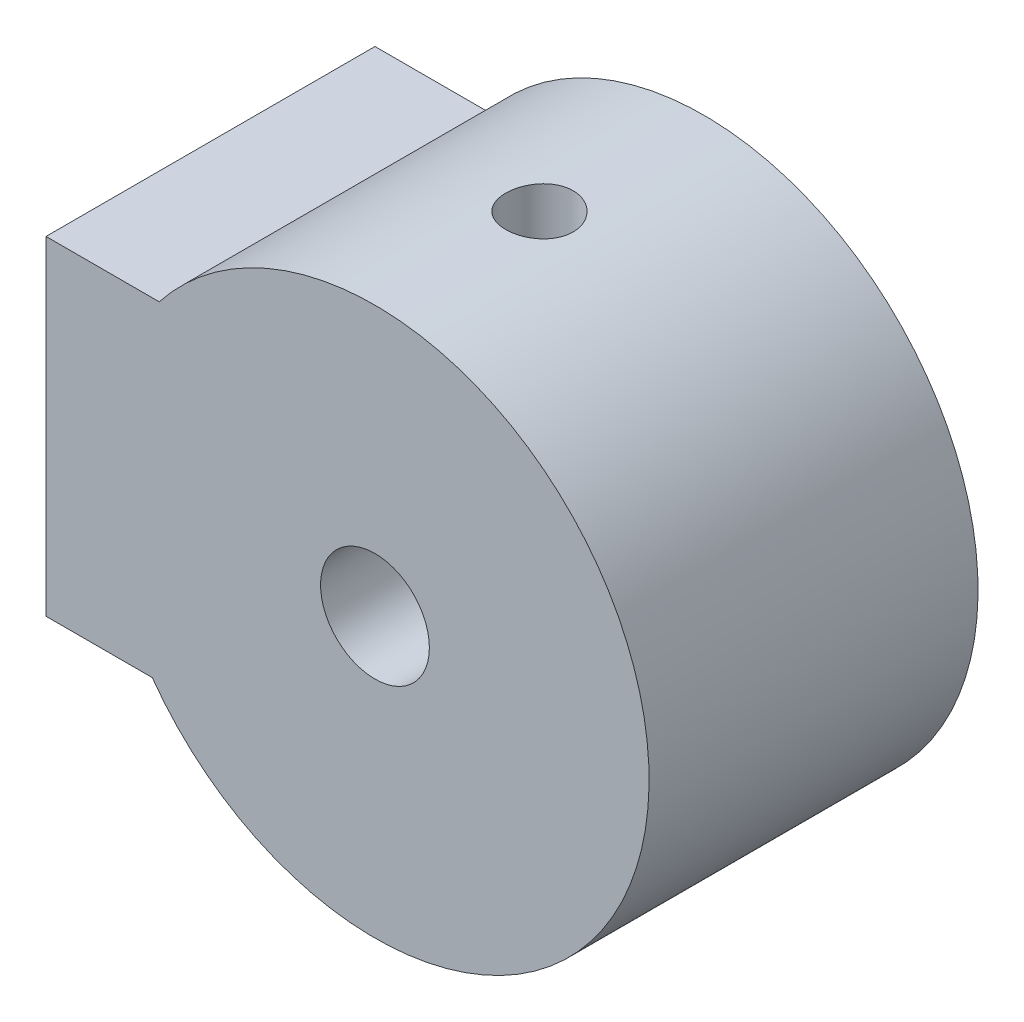
ISO-10303-21;
HEADER;
FILE_DESCRIPTION(('STEP AP214'),'2;1');
FILE_NAME('part.step','',(''),(''),'','','');
FILE_SCHEMA(('AUTOMOTIVE_DESIGN { 1 0 10303 214 1 1 1 1 }'));
ENDSEC;
DATA;
#1=APPLICATION_CONTEXT('core data for automotive mechanical design processes');
#2=APPLICATION_PROTOCOL_DEFINITION('international standard','automotive_design',2000,#1);
#3=PRODUCT_CONTEXT('',#1,'mechanical');
#4=PRODUCT('Part','Part','',(#3));
#5=PRODUCT_RELATED_PRODUCT_CATEGORY('part','',(#4));
#6=PRODUCT_DEFINITION_FORMATION('','',#4);
#7=PRODUCT_DEFINITION_CONTEXT('part definition',#1,'design');
#8=PRODUCT_DEFINITION('design','',#6,#7);
#9=PRODUCT_DEFINITION_SHAPE('','',#8);
#10=(LENGTH_UNIT() NAMED_UNIT(*) SI_UNIT(.MILLI.,.METRE.));
#11=(NAMED_UNIT(*) PLANE_ANGLE_UNIT() SI_UNIT($,.RADIAN.));
#12=(NAMED_UNIT(*) SI_UNIT($,.STERADIAN.) SOLID_ANGLE_UNIT());
#13=UNCERTAINTY_MEASURE_WITH_UNIT(LENGTH_MEASURE(1.E-05),#10,'distance_accuracy_value','');
#14=(GEOMETRIC_REPRESENTATION_CONTEXT(3) GLOBAL_UNCERTAINTY_ASSIGNED_CONTEXT((#13)) GLOBAL_UNIT_ASSIGNED_CONTEXT((#10,
#11,#12)) REPRESENTATION_CONTEXT('',''));
#15=CARTESIAN_POINT('',(0.,0.,0.));
#16=DIRECTION('',(0.,0.,1.));
#17=DIRECTION('',(1.,0.,0.));
#18=AXIS2_PLACEMENT_3D('',#15,#16,#17);
#19=CARTESIAN_POINT('',(19.05,9.25604473628377,19.05));
#20=DIRECTION('',(0.,0.,-1.));
#21=DIRECTION('',(-1.,0.,0.));
#22=AXIS2_PLACEMENT_3D('',#19,#20,#21);
#23=CYLINDRICAL_SURFACE('',#22,15.875);
#24=CARTESIAN_POINT('',(19.05,25.1310447362838,11.475));
#25=CARTESIAN_POINT('',(18.9409083643428,25.1310432359533,11.4749953560447));
#26=CARTESIAN_POINT('',(18.8317481815271,25.1299083507984,11.465814534338));
#27=CARTESIAN_POINT('',(18.616464302043,25.1254902293752,11.4293347568982));
#28=CARTESIAN_POINT('',(18.5103439147029,25.1222047381502,11.4020167835412));
#29=CARTESIAN_POINT('',(18.3042875505686,25.1138556039573,11.3300787802362));
#30=CARTESIAN_POINT('',(18.2043475029054,25.1087931464367,11.2854702830557));
#31=CARTESIAN_POINT('',(18.0133915108261,25.0974534150214,11.1802424652643));
#32=CARTESIAN_POINT('',(17.9223740162678,25.0911763527092,11.1196259325617));
#33=CARTESIAN_POINT('',(17.7513429490255,25.0780710927105,10.9837575835535));
#34=CARTESIAN_POINT('',(17.6713837146966,25.0712404180887,10.9084375981876));
#35=CARTESIAN_POINT('',(17.5252068104353,25.0578178123172,10.7454466967293));
#36=CARTESIAN_POINT('',(17.4589898344333,25.0512258932375,10.6577751573066));
#37=CARTESIAN_POINT('',(17.3419755614588,25.0390027075675,10.4722178237964));
#38=CARTESIAN_POINT('',(17.2912290228033,25.0333746292392,10.3742997929141));
#39=CARTESIAN_POINT('',(17.2069202812983,25.0237488673918,10.1712507961796));
#40=CARTESIAN_POINT('',(17.1733574486991,25.0197511241252,10.066120094818));
#41=CARTESIAN_POINT('',(17.1245336186474,25.0138622268302,9.85219319749525));
#42=CARTESIAN_POINT('',(17.109181003301,25.0119605307777,9.74341820642189));
#43=CARTESIAN_POINT('',(17.0969299426077,25.0104467450156,9.52482027436539));
#44=CARTESIAN_POINT('',(17.1000307797705,25.010834566287,9.41499737429185));
#45=CARTESIAN_POINT('',(17.1245233669943,25.0138463499001,9.19805893125664));
#46=CARTESIAN_POINT('',(17.1458142809262,25.0164579843358,9.09093180833696));
#47=CARTESIAN_POINT('',(17.2059253628627,25.0236038987797,8.88178257397178));
#48=CARTESIAN_POINT('',(17.2447458748643,25.0281382165182,8.7797605627515));
#49=CARTESIAN_POINT('',(17.3389228418646,25.0386325927656,8.58340382196518));
#50=CARTESIAN_POINT('',(17.3943232031673,25.0445964284316,8.4890903609214));
#51=CARTESIAN_POINT('',(17.5200558335176,25.0572749219276,8.31106096012575));
#52=CARTESIAN_POINT('',(17.590388762192,25.0639896129193,8.22734548878723));
#53=CARTESIAN_POINT('',(17.7445492857712,25.0774680556345,8.07230309340675));
#54=CARTESIAN_POINT('',(17.8284638122925,25.0842318356984,8.00106258048572));
#55=CARTESIAN_POINT('',(18.0071059480917,25.0970043840567,7.8736648816185));
#56=CARTESIAN_POINT('',(18.1018335808671,25.1030131507104,7.81750772845019));
#57=CARTESIAN_POINT('',(18.299478954148,25.1136021957743,7.72187111610527));
#58=CARTESIAN_POINT('',(18.402399291316,25.1181820190028,7.68239696978903));
#59=CARTESIAN_POINT('',(18.6134762028136,25.1253929854182,7.62131499324888));
#60=CARTESIAN_POINT('',(18.721632540237,25.1280242166828,7.59970635548679));
#61=CARTESIAN_POINT('',(18.9393640276831,25.1310300951961,7.57508055556936));
#62=CARTESIAN_POINT('',(19.0489255207831,25.1314191926904,7.57194433827909));
#63=CARTESIAN_POINT('',(19.2670125377665,25.1299359525648,7.58403835887203));
#64=CARTESIAN_POINT('',(19.3755380828914,25.128063661414,7.59926821935188));
#65=CARTESIAN_POINT('',(19.5881219986482,25.1222770441713,7.64756318359314));
#66=CARTESIAN_POINT('',(19.692193435241,25.1183692077425,7.68057161756198));
#67=CARTESIAN_POINT('',(19.893323454738,25.1089490921984,7.76342788747769));
#68=CARTESIAN_POINT('',(19.9903818068662,25.1034367603148,7.81327627726212));
#69=CARTESIAN_POINT('',(20.1752628609096,25.0913863764848,7.92868617745236));
#70=CARTESIAN_POINT('',(20.2630370868871,25.0848433459949,7.99432481525716));
#71=CARTESIAN_POINT('',(20.4263653423935,25.0714793305272,8.13934271753309));
#72=CARTESIAN_POINT('',(20.5019189038951,25.0646583349164,8.21872250802216));
#73=CARTESIAN_POINT('',(20.6390826917969,25.0514626777424,8.38949338081263));
#74=CARTESIAN_POINT('',(20.700614072545,25.0450906728285,8.48094802733327));
#75=CARTESIAN_POINT('',(20.8074424065883,25.0335578622644,8.67296362159593));
#76=CARTESIAN_POINT('',(20.8527396758609,25.0283970330409,8.77352439205049));
#77=CARTESIAN_POINT('',(20.9256859007477,25.0198888689889,8.98064176127574));
#78=CARTESIAN_POINT('',(20.9533795434053,25.0165369455254,9.08718242486343));
#79=CARTESIAN_POINT('',(20.9904764095143,25.0120128523629,9.30344559111588));
#80=CARTESIAN_POINT('',(20.999880452299,25.0108405850201,9.41316795102422));
#81=CARTESIAN_POINT('',(21.0001164913923,25.0108113067968,9.63189556518495));
#82=CARTESIAN_POINT('',(20.9910723544037,25.0119388542553,9.74090070447582));
#83=CARTESIAN_POINT('',(20.9549308187889,25.0163489869564,9.95582921735795));
#84=CARTESIAN_POINT('',(20.9278334162005,25.019631572672,10.0617525902728));
#85=CARTESIAN_POINT('',(20.8563928550996,25.0279771882843,10.2674959323579));
#86=CARTESIAN_POINT('',(20.8120554467467,25.0330396244833,10.3673179237248));
#87=CARTESIAN_POINT('',(20.7074056638004,25.0443755351535,10.5581248809151));
#88=CARTESIAN_POINT('',(20.6470931162568,25.0506490227356,10.6491097510513));
#89=CARTESIAN_POINT('',(20.5117449195196,25.0637506485335,10.8202931432372));
#90=CARTESIAN_POINT('',(20.4366169334528,25.0705820992451,10.9004184093192));
#91=CARTESIAN_POINT('',(20.2739624902651,25.0840005599526,11.0469726710189));
#92=CARTESIAN_POINT('',(20.1864331100613,25.0905875118555,11.1133984284899));
#93=CARTESIAN_POINT('',(20.0010926823431,25.1028014311103,11.2308748233476));
#94=CARTESIAN_POINT('',(19.903245021388,25.1084247804647,11.2818680428433));
#95=CARTESIAN_POINT('',(19.7003616367364,25.1180410396347,11.3666270676105));
#96=CARTESIAN_POINT('',(19.5953338942139,25.1220357264922,11.4004116593957));
#97=CARTESIAN_POINT('',(19.4164648109537,25.126977709808,11.4416751975968));
#98=CARTESIAN_POINT('',(19.3437529872773,25.1284954450309,11.4541541232119));
#99=CARTESIAN_POINT('',(19.197371200054,25.1305294615522,11.4708180639596));
#100=CARTESIAN_POINT('',(19.1237012432481,25.1310457498924,11.4750031374109));
#101=CARTESIAN_POINT('',(19.05,25.1310447362838,11.475));
#102=B_SPLINE_CURVE_WITH_KNOTS('',3,(#24,#25,#26,#27,#28,#29,#30,#31,#32,#33,#34,#35,#36,#37,
#38,#39,#40,#41,#42,#43,#44,#45,#46,#47,#48,#49,#50,#51,#52,#53,#54,#55,#56,#57,#58,#59,#60,#61,
#62,#63,#64,#65,#66,#67,#68,#69,#70,#71,#72,#73,#74,#75,#76,#77,#78,#79,#80,#81,#82,#83,#84,#85,
#86,#87,#88,#89,#90,#91,#92,#93,#94,#95,#96,#97,#98,#99,#100,#101),.UNSPECIFIED.,.T.,.F.,(4,2,2,
2,2,2,2,2,2,2,2,2,2,2,2,2,2,2,2,2,2,2,2,2,2,2,2,2,2,2,2,2,2,2,2,2,2,2,4),(0.,0.327005707130553,
0.654354837194615,0.981486000299128,1.30856022881588,1.63718850480973,1.96583337121433,
2.29554519184131,2.62524492830033,2.95327877138886,3.28129986024671,3.60751428578232,
3.93373511315536,4.26082759112558,4.58793452099079,4.91722458863021,5.24651537184951,
5.57591094194033,5.90529162221994,6.2325470940088,6.55979584116038,6.88600759251479,
7.21223007346469,7.54007955036916,7.86794158028565,8.19760400663521,8.52726001615431,
8.85607581187648,9.18487687704405,9.51147753939168,9.8380782734195,10.1645701677125,
10.4910655968194,10.8196641592899,11.1483403036608,11.4782246892999,11.8077481669054,
12.0286715813092,12.2495934422709),.UNSPECIFIED.);
#103=CARTESIAN_POINT('',(19.05,25.1310447362838,11.475));
#104=VERTEX_POINT('',#103);
#105=EDGE_CURVE('E121',#104,#104,#102,.T.);
#106=ORIENTED_EDGE('',*,*,#105,.T.);
#107=EDGE_LOOP('',(#106));
#108=FACE_BOUND('',#107,.T.);
#109=CARTESIAN_POINT('',(19.05,9.25604473628377,0.));
#110=DIRECTION('',(0.,0.,1.));
#111=DIRECTION('',(1.,0.,0.));
#112=AXIS2_PLACEMENT_3D('',#109,#110,#111);
#113=CIRCLE('',#112,15.875);
#114=CARTESIAN_POINT('',(6.15266458372453,0.,0.));
#115=VERTEX_POINT('',#114);
#116=CARTESIAN_POINT('',(6.55623894528453,19.05,0.));
#117=VERTEX_POINT('',#116);
#118=EDGE_CURVE('E122',#115,#117,#113,.T.);
#119=ORIENTED_EDGE('',*,*,#118,.T.);
#120=DIRECTION('',(0.,0.,-1.));
#121=VECTOR('',#120,1.);
#122=CARTESIAN_POINT('',(6.55623894528453,19.05,19.05));
#123=LINE('',#122,#121);
#124=CARTESIAN_POINT('',(6.55623894528453,19.05,19.05));
#125=VERTEX_POINT('',#124);
#126=EDGE_CURVE('E11',#125,#117,#123,.T.);
#127=ORIENTED_EDGE('',*,*,#126,.F.);
#128=CARTESIAN_POINT('',(19.05,9.25604473628377,19.05));
#129=DIRECTION('',(0.,0.,1.));
#130=DIRECTION('',(1.,0.,0.));
#131=AXIS2_PLACEMENT_3D('',#128,#129,#130);
#132=CIRCLE('',#131,15.875);
#133=CARTESIAN_POINT('',(6.15266458372453,0.,19.05));
#134=VERTEX_POINT('',#133);
#135=EDGE_CURVE('E90',#134,#125,#132,.T.);
#136=ORIENTED_EDGE('',*,*,#135,.F.);
#137=DIRECTION('',(0.,0.,-1.));
#138=VECTOR('',#137,1.);
#139=CARTESIAN_POINT('',(6.15266458372453,0.,19.05));
#140=LINE('',#139,#138);
#141=EDGE_CURVE('E64',#134,#115,#140,.T.);
#142=ORIENTED_EDGE('',*,*,#141,.T.);
#143=EDGE_LOOP('',(#119,#127,#136,#142));
#144=FACE_BOUND('',#143,.T.);
#145=ADVANCED_FACE('F50',(#108,#144),#23,.T.);
#146=CARTESIAN_POINT('',(0.,19.05,19.05));
#147=DIRECTION('',(0.,1.,0.));
#148=DIRECTION('',(0.,0.,1.));
#149=AXIS2_PLACEMENT_3D('',#146,#147,#148);
#150=PLANE('',#149);
#151=DIRECTION('',(1.,0.,0.));
#152=VECTOR('',#151,1.);
#153=CARTESIAN_POINT('',(0.,19.05,0.));
#154=LINE('',#153,#152);
#155=CARTESIAN_POINT('',(0.,19.05,0.));
#156=VERTEX_POINT('',#155);
#157=EDGE_CURVE('E98',#156,#117,#154,.T.);
#158=ORIENTED_EDGE('',*,*,#157,.F.);
#159=DIRECTION('',(0.,0.,-1.));
#160=VECTOR('',#159,1.);
#161=CARTESIAN_POINT('',(0.,19.05,19.05));
#162=LINE('',#161,#160);
#163=CARTESIAN_POINT('',(0.,19.05,19.05));
#164=VERTEX_POINT('',#163);
#165=EDGE_CURVE('E60',#164,#156,#162,.T.);
#166=ORIENTED_EDGE('',*,*,#165,.F.);
#167=DIRECTION('',(1.,0.,0.));
#168=VECTOR('',#167,1.);
#169=CARTESIAN_POINT('',(0.,19.05,19.05));
#170=LINE('',#169,#168);
#171=EDGE_CURVE('E96',#164,#125,#170,.T.);
#172=ORIENTED_EDGE('',*,*,#171,.T.);
#173=ORIENTED_EDGE('',*,*,#126,.T.);
#174=EDGE_LOOP('',(#158,#166,#172,#173));
#175=FACE_BOUND('',#174,.T.);
#176=ADVANCED_FACE('F92',(#175),#150,.T.);
#177=CARTESIAN_POINT('',(0.,0.,19.05));
#178=DIRECTION('',(-1.,0.,0.));
#179=DIRECTION('',(0.,0.,1.));
#180=AXIS2_PLACEMENT_3D('',#177,#178,#179);
#181=PLANE('',#180);
#182=DIRECTION('',(0.,1.,0.));
#183=VECTOR('',#182,1.);
#184=CARTESIAN_POINT('',(0.,0.,0.));
#185=LINE('',#184,#183);
#186=CARTESIAN_POINT('',(0.,0.,0.));
#187=VERTEX_POINT('',#186);
#188=EDGE_CURVE('E130',#187,#156,#185,.T.);
#189=ORIENTED_EDGE('',*,*,#188,.F.);
#190=DIRECTION('',(0.,0.,-1.));
#191=VECTOR('',#190,1.);
#192=CARTESIAN_POINT('',(0.,0.,19.05));
#193=LINE('',#192,#191);
#194=CARTESIAN_POINT('',(0.,0.,19.05));
#195=VERTEX_POINT('',#194);
#196=EDGE_CURVE('E77',#195,#187,#193,.T.);
#197=ORIENTED_EDGE('',*,*,#196,.F.);
#198=DIRECTION('',(0.,1.,0.));
#199=VECTOR('',#198,1.);
#200=CARTESIAN_POINT('',(0.,0.,19.05));
#201=LINE('',#200,#199);
#202=EDGE_CURVE('E106',#195,#164,#201,.T.);
#203=ORIENTED_EDGE('',*,*,#202,.T.);
#204=ORIENTED_EDGE('',*,*,#165,.T.);
#205=EDGE_LOOP('',(#189,#197,#203,#204));
#206=FACE_BOUND('',#205,.T.);
#207=ADVANCED_FACE('F108',(#206),#181,.T.);
#208=CARTESIAN_POINT('',(0.,0.,19.05));
#209=DIRECTION('',(0.,-1.,0.));
#210=DIRECTION('',(0.,0.,-1.));
#211=AXIS2_PLACEMENT_3D('',#208,#209,#210);
#212=PLANE('',#211);
#213=DIRECTION('',(-1.,0.,0.));
#214=VECTOR('',#213,1.);
#215=CARTESIAN_POINT('',(0.,0.,0.));
#216=LINE('',#215,#214);
#217=EDGE_CURVE('E128',#115,#187,#216,.T.);
#218=ORIENTED_EDGE('',*,*,#217,.F.);
#219=ORIENTED_EDGE('',*,*,#141,.F.);
#220=DIRECTION('',(-1.,0.,0.));
#221=VECTOR('',#220,1.);
#222=CARTESIAN_POINT('',(0.,0.,19.05));
#223=LINE('',#222,#221);
#224=EDGE_CURVE('E112',#134,#195,#223,.T.);
#225=ORIENTED_EDGE('',*,*,#224,.T.);
#226=ORIENTED_EDGE('',*,*,#196,.T.);
#227=EDGE_LOOP('',(#218,#219,#225,#226));
#228=FACE_BOUND('',#227,.T.);
#229=ADVANCED_FACE('F172',(#228),#212,.T.);
#230=CARTESIAN_POINT('',(19.05,9.525,19.05));
#231=DIRECTION('',(0.,0.,-1.));
#232=DIRECTION('',(-1.,0.,0.));
#233=AXIS2_PLACEMENT_3D('',#230,#231,#232);
#234=CYLINDRICAL_SURFACE('',#233,3.15);
#235=CARTESIAN_POINT('',(19.05,12.675,11.475));
#236=CARTESIAN_POINT('',(19.1492353004504,12.6749928691529,11.4749922057761));
#237=CARTESIAN_POINT('',(19.2486025493159,12.6702606351288,11.4673725129902));
#238=CARTESIAN_POINT('',(19.4443016539985,12.6517776928205,11.4372954050273));
#239=CARTESIAN_POINT('',(19.5406268847231,12.6380085559057,11.4148076692926));
#240=CARTESIAN_POINT('',(19.7270191834312,12.6028397589278,11.356294705491));
#241=CARTESIAN_POINT('',(19.8171146773199,12.5814779267164,11.3203365418608));
#242=CARTESIAN_POINT('',(19.9896881344051,12.5329119155241,11.2363462437159));
#243=CARTESIAN_POINT('',(20.0721671810619,12.5057085693509,11.1883158301406));
#244=CARTESIAN_POINT('',(20.2345442786094,12.4451784538048,11.0773459997078));
#245=CARTESIAN_POINT('',(20.3137224855253,12.4115375707552,11.0135279702844));
#246=CARTESIAN_POINT('',(20.4609515348662,12.3425065147286,10.8748023348964));
#247=CARTESIAN_POINT('',(20.5289873291943,12.3071140588026,10.7998799880588));
#248=CARTESIAN_POINT('',(20.6611565798322,12.2329766560378,10.6294459445947));
#249=CARTESIAN_POINT('',(20.723582055573,12.1944078926808,10.5325216349553));
#250=CARTESIAN_POINT('',(20.8310609786975,12.1239354376646,10.3272964962699));
#251=CARTESIAN_POINT('',(20.8761435322016,12.0920206204888,10.2190151196864));
#252=CARTESIAN_POINT('',(20.9375922253548,12.0470151852677,10.0222340016538));
#253=CARTESIAN_POINT('',(20.958349823404,12.0311995391122,9.93573258695842));
#254=CARTESIAN_POINT('',(20.9878857871351,12.0084368798423,9.75961359097816));
#255=CARTESIAN_POINT('',(20.9966805709667,12.0014777126591,9.67000045401151));
#256=CARTESIAN_POINT('',(21.0017687024597,11.997470991763,9.48996911721868));
#257=CARTESIAN_POINT('',(20.998031395841,12.0004477418458,9.39954948368029));
#258=CARTESIAN_POINT('',(20.9782379270247,12.0158925727401,9.22087379982354));
#259=CARTESIAN_POINT('',(20.9621720241481,12.028368158409,9.13261951724901));
#260=CARTESIAN_POINT('',(20.9190728927365,12.0606979976706,8.9622942857752));
#261=CARTESIAN_POINT('',(20.8922689332863,12.080397315249,8.8801341812745));
#262=CARTESIAN_POINT('',(20.8287315039771,12.1250227302106,8.72129554417249));
#263=CARTESIAN_POINT('',(20.7919944953723,12.1499506896375,8.64461897746915));
#264=CARTESIAN_POINT('',(20.7018576385304,12.2077650678329,8.48392082282796));
#265=CARTESIAN_POINT('',(20.6466354365722,12.2412718204192,8.40114477192781));
#266=CARTESIAN_POINT('',(20.5245436031061,12.3094426184056,8.24513741409472));
#267=CARTESIAN_POINT('',(20.4576621746876,12.3441078069279,8.17191590701448));
#268=CARTESIAN_POINT('',(20.3016029996692,12.4171500128074,8.02526899272332));
#269=CARTESIAN_POINT('',(20.2105713943558,12.4552437902548,7.95365296045629));
#270=CARTESIAN_POINT('',(20.0155233678761,12.5251626954663,7.82683314876425));
#271=CARTESIAN_POINT('',(19.9115125879334,12.5569905312398,7.77162227409458));
#272=CARTESIAN_POINT('',(19.6991610063069,12.6092098311429,7.68283723248191));
#273=CARTESIAN_POINT('',(19.5913981530067,12.6301464682345,7.64821561997253));
#274=CARTESIAN_POINT('',(19.3700111916193,12.660684734243,7.59810536355274));
#275=CARTESIAN_POINT('',(19.256395286665,12.6703017996124,7.58259066228654));
#276=CARTESIAN_POINT('',(19.0445313864947,12.6765143239743,7.57255409920914));
#277=CARTESIAN_POINT('',(18.9464512507248,12.6748000293192,7.57530752158206));
#278=CARTESIAN_POINT('',(18.7523810973842,12.6624143392599,7.59538010172375));
#279=CARTESIAN_POINT('',(18.656390964943,12.65174343741,7.61269845689145));
#280=CARTESIAN_POINT('',(18.4725550269779,12.6229705382718,7.66012470687901));
#281=CARTESIAN_POINT('',(18.3845412425748,12.6051447359818,7.68975855700714));
#282=CARTESIAN_POINT('',(18.2148083901791,12.5635192095683,7.76051249793836));
#283=CARTESIAN_POINT('',(18.1330904189267,12.5397184476592,7.80163458426369));
#284=CARTESIAN_POINT('',(17.9692420931341,12.485178586624,7.89882655833081));
#285=CARTESIAN_POINT('',(17.8879173191527,12.4539797277938,7.95599225702701));
#286=CARTESIAN_POINT('',(17.7354309697877,12.3887913133343,8.08133511996943));
#287=CARTESIAN_POINT('',(17.6642810442094,12.3547986278767,8.14952471890309));
#288=CARTESIAN_POINT('',(17.5237184362585,12.2818247046636,8.30616439803478));
#289=CARTESIAN_POINT('',(17.4559830305456,12.2428196544329,8.39611632274301));
#290=CARTESIAN_POINT('',(17.3363829943162,12.1690417274558,8.58759291345672));
#291=CARTESIAN_POINT('',(17.2845058707171,12.1342655323117,8.68910838275719));
#292=CARTESIAN_POINT('',(17.2077310181003,12.0804380439955,8.87945972897159));
#293=CARTESIAN_POINT('',(17.1794452492233,12.059616058101,8.96642132874409));
#294=CARTESIAN_POINT('',(17.1351980367137,12.0263619509733,9.144922919918));
#295=CARTESIAN_POINT('',(17.1192177748239,12.0139170227665,9.23645569162669));
#296=CARTESIAN_POINT('',(17.1004662008905,11.9992621689772,9.42220342414273));
#297=CARTESIAN_POINT('',(17.0977637750432,11.9971056217936,9.51642982718865));
#298=CARTESIAN_POINT('',(17.1059590550412,12.0035533455534,9.70393513127383));
#299=CARTESIAN_POINT('',(17.1168621721371,12.0121618980378,9.79721364043404));
#300=CARTESIAN_POINT('',(17.1502590966149,12.0377427015133,9.97326061700676));
#301=CARTESIAN_POINT('',(17.171857119227,12.0540646855169,10.0563011889567));
#302=CARTESIAN_POINT('',(17.2251475613548,12.0927799928179,10.2175556944132));
#303=CARTESIAN_POINT('',(17.2568440356383,12.1151757543426,10.2957676740404));
#304=CARTESIAN_POINT('',(17.3347752067082,12.1675390183357,10.4575871807417));
#305=CARTESIAN_POINT('',(17.3824653606994,12.1981362283825,10.5402866799221));
#306=CARTESIAN_POINT('',(17.4888543783734,12.2616349116192,10.6973201845415));
#307=CARTESIAN_POINT('',(17.5475622719782,12.2945382609172,10.7716472475652));
#308=CARTESIAN_POINT('',(17.6873442084,12.3662923086105,10.9243985162376));
#309=CARTESIAN_POINT('',(17.7705484584247,12.4050858364039,11.0009203444026));
#310=CARTESIAN_POINT('',(17.9501858097538,12.4783603659215,11.1392405880135));
#311=CARTESIAN_POINT('',(18.0466261512255,12.5128389875128,11.2010308943052));
#312=CARTESIAN_POINT('',(18.2503526710698,12.5736431015491,11.3071645896669));
#313=CARTESIAN_POINT('',(18.3575613541631,12.6000219882131,11.351622782146));
#314=CARTESIAN_POINT('',(18.5241790834224,12.6313204786695,11.4036719144855));
#315=CARTESIAN_POINT('',(18.5806283320859,12.6403702289463,11.4185745638655));
#316=CARTESIAN_POINT('',(18.6950064498608,12.6554621420536,11.4433045005786));
#317=CARTESIAN_POINT('',(18.7529341576955,12.6615065933787,11.4531356500055));
#318=CARTESIAN_POINT('',(18.8508088207913,12.6689459130848,11.4652086852268));
#319=CARTESIAN_POINT('',(18.8905211591412,12.6712119414929,11.468876156533));
#320=CARTESIAN_POINT('',(18.9701485335165,12.674240465171,11.4737734557975));
#321=CARTESIAN_POINT('',(19.0100635816228,12.6750028697499,11.4750031367204));
#322=CARTESIAN_POINT('',(19.05,12.675,11.475));
#323=B_SPLINE_CURVE_WITH_KNOTS('',3,(#235,#236,#237,#238,#239,#240,#241,#242,#243,#244,#245,
#246,#247,#248,#249,#250,#251,#252,#253,#254,#255,#256,#257,#258,#259,#260,#261,#262,#263,#264,
#265,#266,#267,#268,#269,#270,#271,#272,#273,#274,#275,#276,#277,#278,#279,#280,#281,#282,#283,
#284,#285,#286,#287,#288,#289,#290,#291,#292,#293,#294,#295,#296,#297,#298,#299,#300,#301,#302,
#303,#304,#305,#306,#307,#308,#309,#310,#311,#312,#313,#314,#315,#316,#317,#318,#319,#320,#321,
#322),.UNSPECIFIED.,.T.,.F.,(4,2,2,2,2,2,2,2,2,2,2,2,2,2,2,2,2,2,2,2,2,2,2,2,2,2,2,2,2,2,2,2,2,
2,2,2,2,2,2,2,2,2,2,4),(0.,0.297544674254619,0.595698013878422,0.892386267447734,
1.18903225107996,1.50913593664668,1.82966842723728,2.1926198177626,2.55495939213586,
2.82488553729411,3.09444085210423,3.36465599663368,3.63508485506166,3.90002373359548,
4.16505712384407,4.47887010394223,4.79300246554833,5.15695489127979,5.52074967738765,
5.8639612614006,6.20670426494763,6.49960503762452,6.79248967105289,7.07501470806383,
7.35758885060345,7.66894119826258,7.98064722601341,8.33655753401258,8.69218673058114,
8.97242441767331,9.25223269410961,9.53349111063996,9.814861426047,10.0758719129674,
10.3369873341493,10.6366508181776,10.9365609816181,11.2934246018156,11.6504842109197,
12.0051368477055,12.1821208333342,12.3589698408373,12.4787069897407,12.598451360373),.UNSPECIFIED.);
#324=CARTESIAN_POINT('',(19.05,12.675,11.475));
#325=VERTEX_POINT('',#324);
#326=EDGE_CURVE('E155',#325,#325,#323,.T.);
#327=ORIENTED_EDGE('',*,*,#326,.T.);
#328=EDGE_LOOP('',(#327));
#329=FACE_BOUND('',#328,.T.);
#330=CARTESIAN_POINT('',(19.05,9.525,19.05));
#331=DIRECTION('',(0.,0.,1.));
#332=DIRECTION('',(1.,0.,0.));
#333=AXIS2_PLACEMENT_3D('',#330,#331,#332);
#334=CIRCLE('',#333,3.15);
#335=CARTESIAN_POINT('',(22.2,9.525,19.05));
#336=VERTEX_POINT('',#335);
#337=EDGE_CURVE('E111',#336,#336,#334,.T.);
#338=ORIENTED_EDGE('',*,*,#337,.T.);
#339=EDGE_LOOP('',(#338));
#340=FACE_BOUND('',#339,.T.);
#341=CARTESIAN_POINT('',(19.05,9.525,0.));
#342=DIRECTION('',(0.,0.,1.));
#343=DIRECTION('',(1.,0.,0.));
#344=AXIS2_PLACEMENT_3D('',#341,#342,#343);
#345=CIRCLE('',#344,3.15);
#346=CARTESIAN_POINT('',(22.2,9.525,0.));
#347=VERTEX_POINT('',#346);
#348=EDGE_CURVE('E133',#347,#347,#345,.T.);
#349=ORIENTED_EDGE('',*,*,#348,.F.);
#350=EDGE_LOOP('',(#349));
#351=FACE_BOUND('',#350,.T.);
#352=ADVANCED_FACE('F170',(#329,#340,#351),#234,.F.);
#353=CARTESIAN_POINT('',(0.,0.,19.05));
#354=DIRECTION('',(0.,0.,1.));
#355=DIRECTION('',(1.,0.,0.));
#356=AXIS2_PLACEMENT_3D('',#353,#354,#355);
#357=PLANE('',#356);
#358=ORIENTED_EDGE('',*,*,#135,.T.);
#359=ORIENTED_EDGE('',*,*,#171,.F.);
#360=ORIENTED_EDGE('',*,*,#202,.F.);
#361=ORIENTED_EDGE('',*,*,#224,.F.);
#362=EDGE_LOOP('',(#358,#359,#360,#361));
#363=FACE_BOUND('',#362,.T.);
#364=ORIENTED_EDGE('',*,*,#337,.F.);
#365=EDGE_LOOP('',(#364));
#366=FACE_BOUND('',#365,.T.);
#367=ADVANCED_FACE('F102',(#363,#366),#357,.T.);
#368=CARTESIAN_POINT('',(0.,0.,0.));
#369=DIRECTION('',(0.,0.,1.));
#370=DIRECTION('',(1.,0.,0.));
#371=AXIS2_PLACEMENT_3D('',#368,#369,#370);
#372=PLANE('',#371);
#373=ORIENTED_EDGE('',*,*,#118,.F.);
#374=ORIENTED_EDGE('',*,*,#217,.T.);
#375=ORIENTED_EDGE('',*,*,#188,.T.);
#376=ORIENTED_EDGE('',*,*,#157,.T.);
#377=EDGE_LOOP('',(#373,#374,#375,#376));
#378=FACE_BOUND('',#377,.T.);
#379=ORIENTED_EDGE('',*,*,#348,.T.);
#380=EDGE_LOOP('',(#379));
#381=FACE_BOUND('',#380,.T.);
#382=ADVANCED_FACE('F161',(#378,#381),#372,.F.);
#383=CARTESIAN_POINT('',(19.05,-6.61995526371623,9.525));
#384=DIRECTION('',(0.,1.,0.));
#385=DIRECTION('',(0.,0.,1.));
#386=AXIS2_PLACEMENT_3D('',#383,#384,#385);
#387=CYLINDRICAL_SURFACE('',#386,1.95);
#388=ORIENTED_EDGE('',*,*,#326,.F.);
#389=EDGE_LOOP('',(#388));
#390=FACE_BOUND('',#389,.T.);
#391=ORIENTED_EDGE('',*,*,#105,.F.);
#392=EDGE_LOOP('',(#391));
#393=FACE_BOUND('',#392,.T.);
#394=ADVANCED_FACE('F160',(#390,#393),#387,.F.);
#395=CLOSED_SHELL('',(#145,#176,#207,#229,#352,#367,#382,#394));
#396=MANIFOLD_SOLID_BREP('B2',#395);
#397=ADVANCED_BREP_SHAPE_REPRESENTATION('',(#18,#396),#14);
#398=SHAPE_DEFINITION_REPRESENTATION(#9,#397);
ENDSEC;
END-ISO-10303-21;
